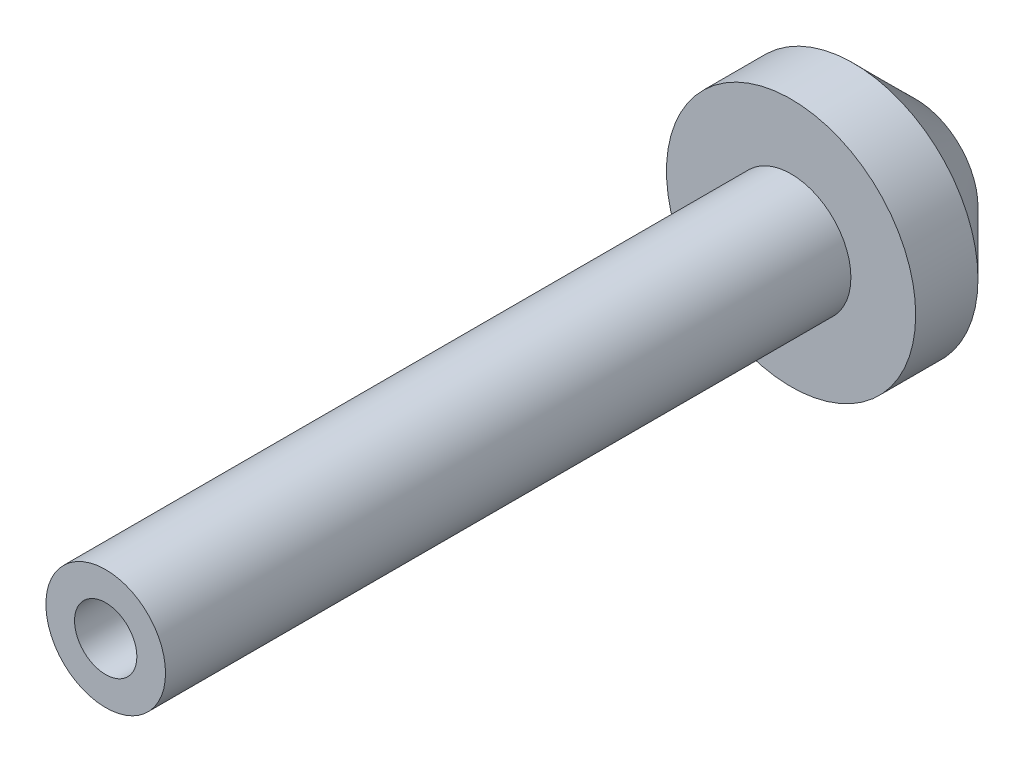
ISO-10303-21;
HEADER;
FILE_DESCRIPTION(('STEP AP214'),'2;1');
FILE_NAME('part.step','',(''),(''),'','','');
FILE_SCHEMA(('AUTOMOTIVE_DESIGN { 1 0 10303 214 1 1 1 1 }'));
ENDSEC;
DATA;
#1=APPLICATION_CONTEXT('core data for automotive mechanical design processes');
#2=APPLICATION_PROTOCOL_DEFINITION('international standard','automotive_design',2000,#1);
#3=PRODUCT_CONTEXT('',#1,'mechanical');
#4=PRODUCT('Part','Part','',(#3));
#5=PRODUCT_RELATED_PRODUCT_CATEGORY('part','',(#4));
#6=PRODUCT_DEFINITION_FORMATION('','',#4);
#7=PRODUCT_DEFINITION_CONTEXT('part definition',#1,'design');
#8=PRODUCT_DEFINITION('design','',#6,#7);
#9=PRODUCT_DEFINITION_SHAPE('','',#8);
#10=(LENGTH_UNIT() NAMED_UNIT(*) SI_UNIT(.MILLI.,.METRE.));
#11=(NAMED_UNIT(*) PLANE_ANGLE_UNIT() SI_UNIT($,.RADIAN.));
#12=(NAMED_UNIT(*) SI_UNIT($,.STERADIAN.) SOLID_ANGLE_UNIT());
#13=UNCERTAINTY_MEASURE_WITH_UNIT(LENGTH_MEASURE(1.E-05),#10,'distance_accuracy_value','');
#14=(GEOMETRIC_REPRESENTATION_CONTEXT(3) GLOBAL_UNCERTAINTY_ASSIGNED_CONTEXT((#13)) GLOBAL_UNIT_ASSIGNED_CONTEXT((#10,
#11,#12)) REPRESENTATION_CONTEXT('',''));
#15=CARTESIAN_POINT('',(0.,0.,0.));
#16=DIRECTION('',(0.,0.,1.));
#17=DIRECTION('',(1.,0.,0.));
#18=AXIS2_PLACEMENT_3D('',#15,#16,#17);
#19=CARTESIAN_POINT('',(0.,0.,5.));
#20=DIRECTION('',(0.,0.,-1.));
#21=DIRECTION('',(-1.,0.,0.));
#22=AXIS2_PLACEMENT_3D('',#19,#20,#21);
#23=CYLINDRICAL_SURFACE('',#22,5.);
#24=CARTESIAN_POINT('',(0.,0.,2.5));
#25=DIRECTION('',(0.,0.,1.));
#26=DIRECTION('',(1.,0.,0.));
#27=AXIS2_PLACEMENT_3D('',#24,#25,#26);
#28=CIRCLE('',#27,5.);
#29=CARTESIAN_POINT('',(5.,0.,2.5));
#30=VERTEX_POINT('',#29);
#31=EDGE_CURVE('E44',#30,#30,#28,.T.);
#32=ORIENTED_EDGE('',*,*,#31,.T.);
#33=EDGE_LOOP('',(#32));
#34=FACE_BOUND('',#33,.T.);
#35=CARTESIAN_POINT('',(0.,0.,5.));
#36=DIRECTION('',(0.,0.,1.));
#37=DIRECTION('',(1.,0.,0.));
#38=AXIS2_PLACEMENT_3D('',#35,#36,#37);
#39=CIRCLE('',#38,5.);
#40=CARTESIAN_POINT('',(5.,0.,5.));
#41=VERTEX_POINT('',#40);
#42=EDGE_CURVE('E52',#41,#41,#39,.T.);
#43=ORIENTED_EDGE('',*,*,#42,.F.);
#44=EDGE_LOOP('',(#43));
#45=FACE_BOUND('',#44,.T.);
#46=ADVANCED_FACE('F36',(#34,#45),#23,.T.);
#47=CARTESIAN_POINT('',(0.,0.,5.));
#48=DIRECTION('',(0.,0.,1.));
#49=DIRECTION('',(1.,0.,0.));
#50=AXIS2_PLACEMENT_3D('',#47,#48,#49);
#51=PLANE('',#50);
#52=CARTESIAN_POINT('',(0.,0.,5.));
#53=DIRECTION('',(0.,0.,1.));
#54=DIRECTION('',(1.,0.,0.));
#55=AXIS2_PLACEMENT_3D('',#52,#53,#54);
#56=CIRCLE('',#55,2.4);
#57=CARTESIAN_POINT('',(2.4,0.,5.));
#58=VERTEX_POINT('',#57);
#59=EDGE_CURVE('E48',#58,#58,#56,.T.);
#60=ORIENTED_EDGE('',*,*,#59,.F.);
#61=EDGE_LOOP('',(#60));
#62=FACE_BOUND('',#61,.T.);
#63=ORIENTED_EDGE('',*,*,#42,.T.);
#64=EDGE_LOOP('',(#63));
#65=FACE_BOUND('',#64,.T.);
#66=ADVANCED_FACE('F87',(#62,#65),#51,.T.);
#67=CARTESIAN_POINT('',(0.,0.,0.));
#68=DIRECTION('',(0.,0.,1.));
#69=DIRECTION('',(1.,0.,0.));
#70=AXIS2_PLACEMENT_3D('',#67,#68,#69);
#71=PLANE('',#70);
#72=CARTESIAN_POINT('',(0.,0.,0.));
#73=DIRECTION('',(0.,0.,1.));
#74=DIRECTION('',(1.,0.,0.));
#75=AXIS2_PLACEMENT_3D('',#72,#73,#74);
#76=CIRCLE('',#75,1.25);
#77=CARTESIAN_POINT('',(1.25,0.,0.));
#78=VERTEX_POINT('',#77);
#79=EDGE_CURVE('E60',#78,#78,#76,.T.);
#80=ORIENTED_EDGE('',*,*,#79,.T.);
#81=EDGE_LOOP('',(#80));
#82=FACE_BOUND('',#81,.T.);
#83=CARTESIAN_POINT('',(0.,0.,0.));
#84=DIRECTION('',(0.,0.,1.));
#85=DIRECTION('',(1.,0.,0.));
#86=AXIS2_PLACEMENT_3D('',#83,#84,#85);
#87=CIRCLE('',#86,2.49999999999999);
#88=CARTESIAN_POINT('',(2.49999999999999,0.,0.));
#89=VERTEX_POINT('',#88);
#90=EDGE_CURVE('E10',#89,#89,#87,.F.);
#91=ORIENTED_EDGE('',*,*,#90,.T.);
#92=EDGE_LOOP('',(#91));
#93=FACE_BOUND('',#92,.T.);
#94=ADVANCED_FACE('F67',(#82,#93),#71,.F.);
#95=CARTESIAN_POINT('',(0.,0.,32.5));
#96=DIRECTION('',(0.,0.,-1.));
#97=DIRECTION('',(-1.,0.,0.));
#98=AXIS2_PLACEMENT_3D('',#95,#96,#97);
#99=CYLINDRICAL_SURFACE('',#98,2.4);
#100=CARTESIAN_POINT('',(0.,0.,32.5));
#101=DIRECTION('',(0.,0.,1.));
#102=DIRECTION('',(1.,0.,0.));
#103=AXIS2_PLACEMENT_3D('',#100,#101,#102);
#104=CIRCLE('',#103,2.4);
#105=CARTESIAN_POINT('',(2.4,0.,32.5));
#106=VERTEX_POINT('',#105);
#107=EDGE_CURVE('E56',#106,#106,#104,.T.);
#108=ORIENTED_EDGE('',*,*,#107,.F.);
#109=EDGE_LOOP('',(#108));
#110=FACE_BOUND('',#109,.T.);
#111=ORIENTED_EDGE('',*,*,#59,.T.);
#112=EDGE_LOOP('',(#111));
#113=FACE_BOUND('',#112,.T.);
#114=ADVANCED_FACE('F78',(#110,#113),#99,.T.);
#115=CARTESIAN_POINT('',(0.,0.,32.5));
#116=DIRECTION('',(0.,0.,1.));
#117=DIRECTION('',(1.,0.,0.));
#118=AXIS2_PLACEMENT_3D('',#115,#116,#117);
#119=PLANE('',#118);
#120=CARTESIAN_POINT('',(0.,0.,32.5));
#121=DIRECTION('',(0.,0.,1.));
#122=DIRECTION('',(1.,0.,0.));
#123=AXIS2_PLACEMENT_3D('',#120,#121,#122);
#124=CIRCLE('',#123,1.25);
#125=CARTESIAN_POINT('',(1.25,0.,32.5));
#126=VERTEX_POINT('',#125);
#127=EDGE_CURVE('E61',#126,#126,#124,.T.);
#128=ORIENTED_EDGE('',*,*,#127,.F.);
#129=EDGE_LOOP('',(#128));
#130=FACE_BOUND('',#129,.T.);
#131=ORIENTED_EDGE('',*,*,#107,.T.);
#132=EDGE_LOOP('',(#131));
#133=FACE_BOUND('',#132,.T.);
#134=ADVANCED_FACE('F75',(#130,#133),#119,.T.);
#135=CARTESIAN_POINT('',(0.,0.,2.5));
#136=DIRECTION('',(0.,0.,1.));
#137=DIRECTION('',(1.,0.,0.));
#138=AXIS2_PLACEMENT_3D('',#135,#136,#137);
#139=CONICAL_SURFACE('',#138,5.,0.78539816339745);
#140=ORIENTED_EDGE('',*,*,#90,.F.);
#141=EDGE_LOOP('',(#140));
#142=FACE_BOUND('',#141,.T.);
#143=ORIENTED_EDGE('',*,*,#31,.F.);
#144=EDGE_LOOP('',(#143));
#145=FACE_BOUND('',#144,.T.);
#146=ADVANCED_FACE('F39',(#142,#145),#139,.T.);
#147=CARTESIAN_POINT('',(0.,0.,0.));
#148=DIRECTION('',(0.,0.,1.));
#149=DIRECTION('',(1.,0.,0.));
#150=AXIS2_PLACEMENT_3D('',#147,#148,#149);
#151=CYLINDRICAL_SURFACE('',#150,1.25);
#152=ORIENTED_EDGE('',*,*,#79,.F.);
#153=EDGE_LOOP('',(#152));
#154=FACE_BOUND('',#153,.T.);
#155=ORIENTED_EDGE('',*,*,#127,.T.);
#156=EDGE_LOOP('',(#155));
#157=FACE_BOUND('',#156,.T.);
#158=ADVANCED_FACE('F69',(#154,#157),#151,.F.);
#159=CLOSED_SHELL('',(#46,#66,#94,#114,#134,#146,#158));
#160=MANIFOLD_SOLID_BREP('B2',#159);
#161=ADVANCED_BREP_SHAPE_REPRESENTATION('',(#18,#160),#14);
#162=SHAPE_DEFINITION_REPRESENTATION(#9,#161);
ENDSEC;
END-ISO-10303-21;
